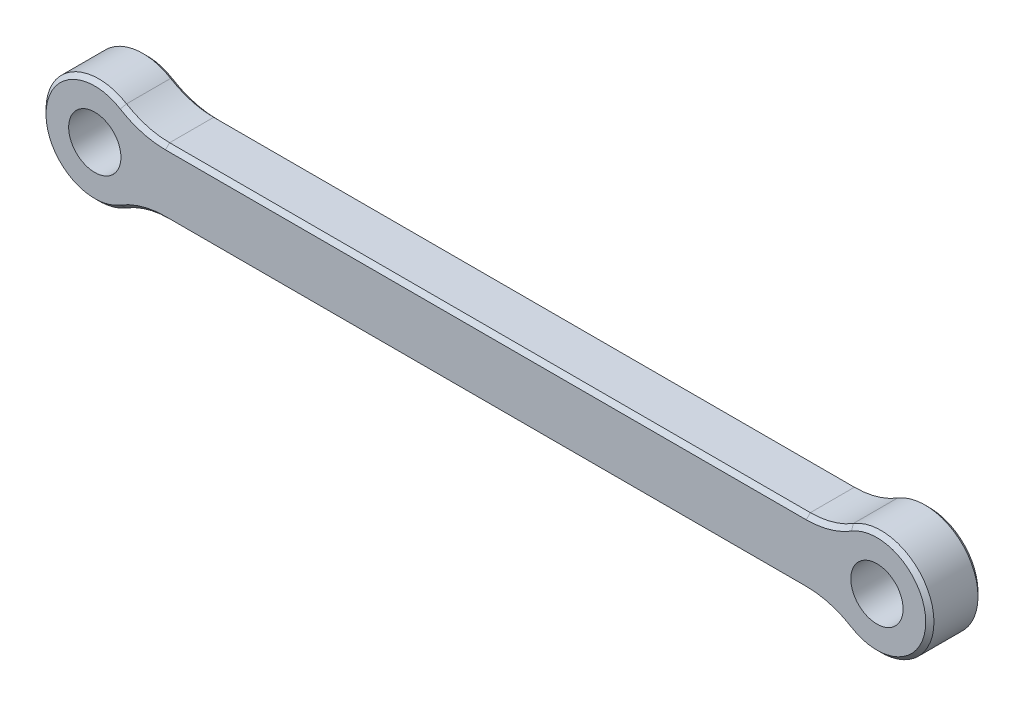
ISO-10303-21;
HEADER;
FILE_DESCRIPTION(('STEP AP214'),'2;1');
FILE_NAME('part.step','',(''),(''),'','','');
FILE_SCHEMA(('AUTOMOTIVE_DESIGN { 1 0 10303 214 1 1 1 1 }'));
ENDSEC;
DATA;
#1=APPLICATION_CONTEXT('core data for automotive mechanical design processes');
#2=APPLICATION_PROTOCOL_DEFINITION('international standard','automotive_design',2000,#1);
#3=PRODUCT_CONTEXT('',#1,'mechanical');
#4=PRODUCT('Part','Part','',(#3));
#5=PRODUCT_RELATED_PRODUCT_CATEGORY('part','',(#4));
#6=PRODUCT_DEFINITION_FORMATION('','',#4);
#7=PRODUCT_DEFINITION_CONTEXT('part definition',#1,'design');
#8=PRODUCT_DEFINITION('design','',#6,#7);
#9=PRODUCT_DEFINITION_SHAPE('','',#8);
#10=(LENGTH_UNIT() NAMED_UNIT(*) SI_UNIT(.MILLI.,.METRE.));
#11=(NAMED_UNIT(*) PLANE_ANGLE_UNIT() SI_UNIT($,.RADIAN.));
#12=(NAMED_UNIT(*) SI_UNIT($,.STERADIAN.) SOLID_ANGLE_UNIT());
#13=UNCERTAINTY_MEASURE_WITH_UNIT(LENGTH_MEASURE(1.E-05),#10,'distance_accuracy_value','');
#14=(GEOMETRIC_REPRESENTATION_CONTEXT(3) GLOBAL_UNCERTAINTY_ASSIGNED_CONTEXT((#13)) GLOBAL_UNIT_ASSIGNED_CONTEXT((#10,
#11,#12)) REPRESENTATION_CONTEXT('',''));
#15=CARTESIAN_POINT('',(0.,0.,0.));
#16=DIRECTION('',(0.,0.,1.));
#17=DIRECTION('',(1.,0.,0.));
#18=AXIS2_PLACEMENT_3D('',#15,#16,#17);
#19=CARTESIAN_POINT('',(95.,0.,6.35));
#20=DIRECTION('',(0.,0.,-1.));
#21=DIRECTION('',(-1.,0.,0.));
#22=AXIS2_PLACEMENT_3D('',#19,#20,#21);
#23=CYLINDRICAL_SURFACE('',#22,3.175);
#24=CARTESIAN_POINT('',(95.,0.,6.35));
#25=DIRECTION('',(0.,0.,1.));
#26=DIRECTION('',(1.,0.,0.));
#27=AXIS2_PLACEMENT_3D('',#24,#25,#26);
#28=CIRCLE('',#27,3.175);
#29=CARTESIAN_POINT('',(98.175,0.,6.35));
#30=VERTEX_POINT('',#29);
#31=EDGE_CURVE('E423',#30,#30,#28,.T.);
#32=ORIENTED_EDGE('',*,*,#31,.T.);
#33=EDGE_LOOP('',(#32));
#34=FACE_BOUND('',#33,.T.);
#35=CARTESIAN_POINT('',(95.,0.,0.));
#36=DIRECTION('',(0.,0.,1.));
#37=DIRECTION('',(1.,0.,0.));
#38=AXIS2_PLACEMENT_3D('',#35,#36,#37);
#39=CIRCLE('',#38,3.175);
#40=CARTESIAN_POINT('',(98.175,0.,0.));
#41=VERTEX_POINT('',#40);
#42=EDGE_CURVE('E797',#41,#41,#39,.T.);
#43=ORIENTED_EDGE('',*,*,#42,.F.);
#44=EDGE_LOOP('',(#43));
#45=FACE_BOUND('',#44,.T.);
#46=ADVANCED_FACE('F85',(#34,#45),#23,.F.);
#47=CARTESIAN_POINT('',(0.,0.,0.));
#48=DIRECTION('',(0.,0.,1.));
#49=DIRECTION('',(1.,0.,0.));
#50=AXIS2_PLACEMENT_3D('',#47,#48,#49);
#51=PLANE('',#50);
#52=CARTESIAN_POINT('',(86.4104351099721,-14.,0.));
#53=DIRECTION('',(0.,0.,1.));
#54=DIRECTION('',(1.,0.,0.));
#55=AXIS2_PLACEMENT_3D('',#52,#53,#54);
#56=CIRCLE('',#55,10.5);
#57=CARTESIAN_POINT('',(91.9014811583917,-5.05022831050228,0.));
#58=VERTEX_POINT('',#57);
#59=CARTESIAN_POINT('',(86.4104351099721,-3.5,0.));
#60=VERTEX_POINT('',#59);
#61=EDGE_CURVE('E275',#58,#60,#56,.T.);
#62=ORIENTED_EDGE('',*,*,#61,.T.);
#63=DIRECTION('',(-1.,0.,0.));
#64=VECTOR('',#63,1.);
#65=CARTESIAN_POINT('',(0.,-3.5,0.));
#66=LINE('',#65,#64);
#67=CARTESIAN_POINT('',(8.5895648900279,-3.5,0.));
#68=VERTEX_POINT('',#67);
#69=EDGE_CURVE('E210',#60,#68,#66,.T.);
#70=ORIENTED_EDGE('',*,*,#69,.T.);
#71=CARTESIAN_POINT('',(8.5895648900279,-14.,0.));
#72=DIRECTION('',(0.,0.,1.));
#73=DIRECTION('',(1.,0.,0.));
#74=AXIS2_PLACEMENT_3D('',#71,#72,#73);
#75=CIRCLE('',#74,10.5);
#76=CARTESIAN_POINT('',(3.09851884160824,-5.05022831050228,0.));
#77=VERTEX_POINT('',#76);
#78=EDGE_CURVE('E278',#68,#77,#75,.T.);
#79=ORIENTED_EDGE('',*,*,#78,.T.);
#80=CARTESIAN_POINT('',(0.,0.,0.));
#81=DIRECTION('',(0.,0.,1.));
#82=DIRECTION('',(1.,0.,0.));
#83=AXIS2_PLACEMENT_3D('',#80,#81,#82);
#84=CIRCLE('',#83,5.925);
#85=CARTESIAN_POINT('',(3.09851884160824,5.05022831050228,0.));
#86=VERTEX_POINT('',#85);
#87=EDGE_CURVE('E272',#77,#86,#84,.F.);
#88=ORIENTED_EDGE('',*,*,#87,.T.);
#89=CARTESIAN_POINT('',(8.5895648900279,14.,0.));
#90=DIRECTION('',(0.,0.,1.));
#91=DIRECTION('',(1.,0.,0.));
#92=AXIS2_PLACEMENT_3D('',#89,#90,#91);
#93=CIRCLE('',#92,10.5);
#94=CARTESIAN_POINT('',(8.5895648900279,3.5,0.));
#95=VERTEX_POINT('',#94);
#96=EDGE_CURVE('E266',#86,#95,#93,.T.);
#97=ORIENTED_EDGE('',*,*,#96,.T.);
#98=DIRECTION('',(1.,0.,0.));
#99=VECTOR('',#98,1.);
#100=CARTESIAN_POINT('',(86.4104351099721,3.5,0.));
#101=LINE('',#100,#99);
#102=CARTESIAN_POINT('',(86.4104351099721,3.5,0.));
#103=VERTEX_POINT('',#102);
#104=EDGE_CURVE('E239',#95,#103,#101,.T.);
#105=ORIENTED_EDGE('',*,*,#104,.T.);
#106=CARTESIAN_POINT('',(86.4104351099721,14.,0.));
#107=DIRECTION('',(0.,0.,1.));
#108=DIRECTION('',(1.,0.,0.));
#109=AXIS2_PLACEMENT_3D('',#106,#107,#108);
#110=CIRCLE('',#109,10.5);
#111=CARTESIAN_POINT('',(91.9014811583917,5.05022831050228,0.));
#112=VERTEX_POINT('',#111);
#113=EDGE_CURVE('E263',#103,#112,#110,.T.);
#114=ORIENTED_EDGE('',*,*,#113,.T.);
#115=CARTESIAN_POINT('',(95.,0.,0.));
#116=DIRECTION('',(0.,0.,1.));
#117=DIRECTION('',(1.,0.,0.));
#118=AXIS2_PLACEMENT_3D('',#115,#116,#117);
#119=CIRCLE('',#118,5.92500000000001);
#120=EDGE_CURVE('E269',#112,#58,#119,.F.);
#121=ORIENTED_EDGE('',*,*,#120,.T.);
#122=EDGE_LOOP('',(#62,#70,#79,#88,#97,#105,#114,#121));
#123=FACE_BOUND('',#122,.T.);
#124=ORIENTED_EDGE('',*,*,#42,.T.);
#125=EDGE_LOOP('',(#124));
#126=FACE_BOUND('',#125,.T.);
#127=CARTESIAN_POINT('',(0.,0.,0.));
#128=DIRECTION('',(0.,0.,1.));
#129=DIRECTION('',(1.,0.,0.));
#130=AXIS2_PLACEMENT_3D('',#127,#128,#129);
#131=CIRCLE('',#130,3.175);
#132=CARTESIAN_POINT('',(3.175,0.,0.));
#133=VERTEX_POINT('',#132);
#134=EDGE_CURVE('E364',#133,#133,#131,.T.);
#135=ORIENTED_EDGE('',*,*,#134,.T.);
#136=EDGE_LOOP('',(#135));
#137=FACE_BOUND('',#136,.T.);
#138=ADVANCED_FACE('F456',(#123,#126,#137),#51,.F.);
#139=CARTESIAN_POINT('',(95.,0.,6.35));
#140=DIRECTION('',(0.,0.,-1.));
#141=DIRECTION('',(-1.,0.,0.));
#142=AXIS2_PLACEMENT_3D('',#139,#140,#141);
#143=CYLINDRICAL_SURFACE('',#142,6.42500000000001);
#144=DIRECTION('',(0.,0.,-1.));
#145=VECTOR('',#144,1.);
#146=CARTESIAN_POINT('',(91.6400027751337,-5.47640791476408,6.35));
#147=LINE('',#146,#145);
#148=CARTESIAN_POINT('',(91.6400027751337,-5.47640791476408,5.85));
#149=VERTEX_POINT('',#148);
#150=CARTESIAN_POINT('',(91.6400027751337,-5.47640791476408,0.5));
#151=VERTEX_POINT('',#150);
#152=EDGE_CURVE('E418',#149,#151,#147,.T.);
#153=ORIENTED_EDGE('',*,*,#152,.T.);
#154=CARTESIAN_POINT('',(95.,0.,0.5));
#155=DIRECTION('',(0.,0.,1.));
#156=DIRECTION('',(1.,0.,0.));
#157=AXIS2_PLACEMENT_3D('',#154,#155,#156);
#158=CIRCLE('',#157,6.42500000000001);
#159=CARTESIAN_POINT('',(91.6400027751337,5.47640791476408,0.5));
#160=VERTEX_POINT('',#159);
#161=EDGE_CURVE('E299',#151,#160,#158,.T.);
#162=ORIENTED_EDGE('',*,*,#161,.T.);
#163=DIRECTION('',(0.,0.,-1.));
#164=VECTOR('',#163,1.);
#165=CARTESIAN_POINT('',(91.6400027751337,5.47640791476408,6.35));
#166=LINE('',#165,#164);
#167=CARTESIAN_POINT('',(91.6400027751337,5.47640791476408,5.85));
#168=VERTEX_POINT('',#167);
#169=EDGE_CURVE('E252',#160,#168,#166,.F.);
#170=ORIENTED_EDGE('',*,*,#169,.T.);
#171=CARTESIAN_POINT('',(95.,0.,5.85));
#172=DIRECTION('',(0.,0.,1.));
#173=DIRECTION('',(1.,0.,0.));
#174=AXIS2_PLACEMENT_3D('',#171,#172,#173);
#175=CIRCLE('',#174,6.42500000000001);
#176=EDGE_CURVE('E296',#168,#149,#175,.F.);
#177=ORIENTED_EDGE('',*,*,#176,.T.);
#178=EDGE_LOOP('',(#153,#162,#170,#177));
#179=FACE_BOUND('',#178,.T.);
#180=ADVANCED_FACE('F429',(#179),#143,.T.);
#181=CARTESIAN_POINT('',(0.,0.,6.35));
#182=DIRECTION('',(0.,0.,1.));
#183=DIRECTION('',(1.,0.,0.));
#184=AXIS2_PLACEMENT_3D('',#181,#182,#183);
#185=PLANE('',#184);
#186=CARTESIAN_POINT('',(8.5895648900279,-14.,6.35));
#187=DIRECTION('',(0.,0.,1.));
#188=DIRECTION('',(1.,0.,0.));
#189=AXIS2_PLACEMENT_3D('',#186,#187,#188);
#190=CIRCLE('',#189,10.5);
#191=CARTESIAN_POINT('',(3.09851884160824,-5.05022831050228,6.35));
#192=VERTEX_POINT('',#191);
#193=CARTESIAN_POINT('',(8.5895648900279,-3.5,6.35));
#194=VERTEX_POINT('',#193);
#195=EDGE_CURVE('E96',#192,#194,#190,.F.);
#196=ORIENTED_EDGE('',*,*,#195,.T.);
#197=DIRECTION('',(1.,0.,0.));
#198=VECTOR('',#197,1.);
#199=CARTESIAN_POINT('',(86.4104351099721,-3.5,6.35));
#200=LINE('',#199,#198);
#201=CARTESIAN_POINT('',(86.4104351099721,-3.5,6.35));
#202=VERTEX_POINT('',#201);
#203=EDGE_CURVE('E12',#194,#202,#200,.T.);
#204=ORIENTED_EDGE('',*,*,#203,.T.);
#205=CARTESIAN_POINT('',(86.4104351099721,-14.,6.35));
#206=DIRECTION('',(0.,0.,1.));
#207=DIRECTION('',(1.,0.,0.));
#208=AXIS2_PLACEMENT_3D('',#205,#206,#207);
#209=CIRCLE('',#208,10.5);
#210=CARTESIAN_POINT('',(91.9014811583917,-5.05022831050228,6.35));
#211=VERTEX_POINT('',#210);
#212=EDGE_CURVE('E335',#202,#211,#209,.F.);
#213=ORIENTED_EDGE('',*,*,#212,.T.);
#214=CARTESIAN_POINT('',(95.,0.,6.35));
#215=DIRECTION('',(0.,0.,1.));
#216=DIRECTION('',(1.,0.,0.));
#217=AXIS2_PLACEMENT_3D('',#214,#215,#216);
#218=CIRCLE('',#217,5.92500000000001);
#219=CARTESIAN_POINT('',(91.9014811583917,5.05022831050228,6.35));
#220=VERTEX_POINT('',#219);
#221=EDGE_CURVE('E329',#211,#220,#218,.T.);
#222=ORIENTED_EDGE('',*,*,#221,.T.);
#223=CARTESIAN_POINT('',(86.4104351099721,14.,6.35));
#224=DIRECTION('',(0.,0.,1.));
#225=DIRECTION('',(1.,0.,0.));
#226=AXIS2_PLACEMENT_3D('',#223,#224,#225);
#227=CIRCLE('',#226,10.5);
#228=CARTESIAN_POINT('',(86.4104351099721,3.5,6.35));
#229=VERTEX_POINT('',#228);
#230=EDGE_CURVE('E323',#220,#229,#227,.F.);
#231=ORIENTED_EDGE('',*,*,#230,.T.);
#232=DIRECTION('',(-1.,0.,0.));
#233=VECTOR('',#232,1.);
#234=CARTESIAN_POINT('',(0.,3.5,6.35));
#235=LINE('',#234,#233);
#236=CARTESIAN_POINT('',(8.5895648900279,3.5,6.35));
#237=VERTEX_POINT('',#236);
#238=EDGE_CURVE('E320',#229,#237,#235,.T.);
#239=ORIENTED_EDGE('',*,*,#238,.T.);
#240=CARTESIAN_POINT('',(8.5895648900279,14.,6.35));
#241=DIRECTION('',(0.,0.,1.));
#242=DIRECTION('',(1.,0.,0.));
#243=AXIS2_PLACEMENT_3D('',#240,#241,#242);
#244=CIRCLE('',#243,10.5);
#245=CARTESIAN_POINT('',(3.09851884160824,5.05022831050228,6.35));
#246=VERTEX_POINT('',#245);
#247=EDGE_CURVE('E326',#237,#246,#244,.F.);
#248=ORIENTED_EDGE('',*,*,#247,.T.);
#249=CARTESIAN_POINT('',(0.,0.,6.35));
#250=DIRECTION('',(0.,0.,1.));
#251=DIRECTION('',(1.,0.,0.));
#252=AXIS2_PLACEMENT_3D('',#249,#250,#251);
#253=CIRCLE('',#252,5.925);
#254=EDGE_CURVE('E332',#246,#192,#253,.T.);
#255=ORIENTED_EDGE('',*,*,#254,.T.);
#256=EDGE_LOOP('',(#196,#204,#213,#222,#231,#239,#248,#255));
#257=FACE_BOUND('',#256,.T.);
#258=ORIENTED_EDGE('',*,*,#31,.F.);
#259=EDGE_LOOP('',(#258));
#260=FACE_BOUND('',#259,.T.);
#261=CARTESIAN_POINT('',(0.,0.,6.35));
#262=DIRECTION('',(0.,0.,1.));
#263=DIRECTION('',(1.,0.,0.));
#264=AXIS2_PLACEMENT_3D('',#261,#262,#263);
#265=CIRCLE('',#264,3.175);
#266=CARTESIAN_POINT('',(3.175,0.,6.35));
#267=VERTEX_POINT('',#266);
#268=EDGE_CURVE('E792',#267,#267,#265,.T.);
#269=ORIENTED_EDGE('',*,*,#268,.F.);
#270=EDGE_LOOP('',(#269));
#271=FACE_BOUND('',#270,.T.);
#272=ADVANCED_FACE('F439',(#257,#260,#271),#185,.T.);
#273=CARTESIAN_POINT('',(0.,4.,6.35));
#274=DIRECTION('',(0.,1.,0.));
#275=DIRECTION('',(0.,0.,1.));
#276=AXIS2_PLACEMENT_3D('',#273,#274,#275);
#277=PLANE('',#276);
#278=DIRECTION('',(0.,0.,-1.));
#279=VECTOR('',#278,1.);
#280=CARTESIAN_POINT('',(86.4104351099721,4.,6.35));
#281=LINE('',#280,#279);
#282=CARTESIAN_POINT('',(86.4104351099721,4.,5.85));
#283=VERTEX_POINT('',#282);
#284=CARTESIAN_POINT('',(86.4104351099721,4.,0.5));
#285=VERTEX_POINT('',#284);
#286=EDGE_CURVE('E408',#283,#285,#281,.T.);
#287=ORIENTED_EDGE('',*,*,#286,.T.);
#288=DIRECTION('',(-1.,0.,0.));
#289=VECTOR('',#288,1.);
#290=CARTESIAN_POINT('',(8.5895648900279,4.,0.5));
#291=LINE('',#290,#289);
#292=CARTESIAN_POINT('',(8.5895648900279,4.,0.5));
#293=VERTEX_POINT('',#292);
#294=EDGE_CURVE('E317',#285,#293,#291,.T.);
#295=ORIENTED_EDGE('',*,*,#294,.T.);
#296=DIRECTION('',(0.,0.,-1.));
#297=VECTOR('',#296,1.);
#298=CARTESIAN_POINT('',(8.5895648900279,4.,6.35));
#299=LINE('',#298,#297);
#300=CARTESIAN_POINT('',(8.5895648900279,4.,5.85));
#301=VERTEX_POINT('',#300);
#302=EDGE_CURVE('E411',#293,#301,#299,.F.);
#303=ORIENTED_EDGE('',*,*,#302,.T.);
#304=DIRECTION('',(1.,0.,0.));
#305=VECTOR('',#304,1.);
#306=CARTESIAN_POINT('',(0.,4.,5.85));
#307=LINE('',#306,#305);
#308=EDGE_CURVE('E314',#301,#283,#307,.T.);
#309=ORIENTED_EDGE('',*,*,#308,.T.);
#310=EDGE_LOOP('',(#287,#295,#303,#309));
#311=FACE_BOUND('',#310,.T.);
#312=ADVANCED_FACE('F407',(#311),#277,.T.);
#313=CARTESIAN_POINT('',(0.,0.,6.35));
#314=DIRECTION('',(0.,0.,-1.));
#315=DIRECTION('',(-1.,0.,0.));
#316=AXIS2_PLACEMENT_3D('',#313,#314,#315);
#317=CYLINDRICAL_SURFACE('',#316,6.425);
#318=DIRECTION('',(0.,0.,-1.));
#319=VECTOR('',#318,1.);
#320=CARTESIAN_POINT('',(3.35999722486632,5.47640791476408,6.35));
#321=LINE('',#320,#319);
#322=CARTESIAN_POINT('',(3.35999722486632,5.47640791476408,5.85));
#323=VERTEX_POINT('',#322);
#324=CARTESIAN_POINT('',(3.35999722486632,5.47640791476408,0.5));
#325=VERTEX_POINT('',#324);
#326=EDGE_CURVE('E245',#323,#325,#321,.T.);
#327=ORIENTED_EDGE('',*,*,#326,.T.);
#328=CARTESIAN_POINT('',(0.,0.,0.5));
#329=DIRECTION('',(0.,0.,1.));
#330=DIRECTION('',(1.,0.,0.));
#331=AXIS2_PLACEMENT_3D('',#328,#329,#330);
#332=CIRCLE('',#331,6.425);
#333=CARTESIAN_POINT('',(3.35999722486632,-5.47640791476408,0.5));
#334=VERTEX_POINT('',#333);
#335=EDGE_CURVE('E293',#325,#334,#332,.T.);
#336=ORIENTED_EDGE('',*,*,#335,.T.);
#337=DIRECTION('',(0.,0.,-1.));
#338=VECTOR('',#337,1.);
#339=CARTESIAN_POINT('',(3.35999722486632,-5.47640791476408,6.35));
#340=LINE('',#339,#338);
#341=CARTESIAN_POINT('',(3.35999722486632,-5.47640791476408,5.85));
#342=VERTEX_POINT('',#341);
#343=EDGE_CURVE('E250',#334,#342,#340,.F.);
#344=ORIENTED_EDGE('',*,*,#343,.T.);
#345=CARTESIAN_POINT('',(0.,0.,5.85));
#346=DIRECTION('',(0.,0.,1.));
#347=DIRECTION('',(1.,0.,0.));
#348=AXIS2_PLACEMENT_3D('',#345,#346,#347);
#349=CIRCLE('',#348,6.425);
#350=EDGE_CURVE('E226',#342,#323,#349,.F.);
#351=ORIENTED_EDGE('',*,*,#350,.T.);
#352=EDGE_LOOP('',(#327,#336,#344,#351));
#353=FACE_BOUND('',#352,.T.);
#354=ADVANCED_FACE('F476',(#353),#317,.T.);
#355=CARTESIAN_POINT('',(0.,-4.,6.35));
#356=DIRECTION('',(0.,1.,0.));
#357=DIRECTION('',(0.,0.,1.));
#358=AXIS2_PLACEMENT_3D('',#355,#356,#357);
#359=PLANE('',#358);
#360=DIRECTION('',(0.,0.,1.));
#361=VECTOR('',#360,1.);
#362=CARTESIAN_POINT('',(8.5895648900279,-4.,0.));
#363=LINE('',#362,#361);
#364=CARTESIAN_POINT('',(8.5895648900279,-4.,5.85));
#365=VERTEX_POINT('',#364);
#366=CARTESIAN_POINT('',(8.5895648900279,-4.,0.5));
#367=VERTEX_POINT('',#366);
#368=EDGE_CURVE('E236',#365,#367,#363,.F.);
#369=ORIENTED_EDGE('',*,*,#368,.T.);
#370=DIRECTION('',(1.,0.,0.));
#371=VECTOR('',#370,1.);
#372=CARTESIAN_POINT('',(0.,-4.,0.5));
#373=LINE('',#372,#371);
#374=CARTESIAN_POINT('',(86.4104351099721,-4.,0.5));
#375=VERTEX_POINT('',#374);
#376=EDGE_CURVE('E208',#367,#375,#373,.T.);
#377=ORIENTED_EDGE('',*,*,#376,.T.);
#378=DIRECTION('',(0.,0.,1.));
#379=VECTOR('',#378,1.);
#380=CARTESIAN_POINT('',(86.4104351099721,-4.,6.35));
#381=LINE('',#380,#379);
#382=CARTESIAN_POINT('',(86.4104351099721,-4.,5.85));
#383=VERTEX_POINT('',#382);
#384=EDGE_CURVE('E234',#375,#383,#381,.T.);
#385=ORIENTED_EDGE('',*,*,#384,.T.);
#386=DIRECTION('',(-1.,0.,0.));
#387=VECTOR('',#386,1.);
#388=CARTESIAN_POINT('',(8.5895648900279,-4.,5.85));
#389=LINE('',#388,#387);
#390=EDGE_CURVE('E240',#383,#365,#389,.T.);
#391=ORIENTED_EDGE('',*,*,#390,.T.);
#392=EDGE_LOOP('',(#369,#377,#385,#391));
#393=FACE_BOUND('',#392,.T.);
#394=ADVANCED_FACE('F232',(#393),#359,.F.);
#395=CARTESIAN_POINT('',(0.,0.,6.35));
#396=DIRECTION('',(0.,0.,-1.));
#397=DIRECTION('',(-1.,0.,0.));
#398=AXIS2_PLACEMENT_3D('',#395,#396,#397);
#399=CYLINDRICAL_SURFACE('',#398,3.175);
#400=ORIENTED_EDGE('',*,*,#268,.T.);
#401=EDGE_LOOP('',(#400));
#402=FACE_BOUND('',#401,.T.);
#403=ORIENTED_EDGE('',*,*,#134,.F.);
#404=EDGE_LOOP('',(#403));
#405=FACE_BOUND('',#404,.T.);
#406=ADVANCED_FACE('F505',(#402,#405),#399,.F.);
#407=CARTESIAN_POINT('',(86.4104351099721,14.,6.35));
#408=DIRECTION('',(0.,0.,-1.));
#409=DIRECTION('',(-1.,0.,0.));
#410=AXIS2_PLACEMENT_3D('',#407,#408,#409);
#411=CYLINDRICAL_SURFACE('',#410,10.);
#412=ORIENTED_EDGE('',*,*,#169,.F.);
#413=CARTESIAN_POINT('',(86.4104351099721,14.,0.5));
#414=DIRECTION('',(0.,0.,1.));
#415=DIRECTION('',(1.,0.,0.));
#416=AXIS2_PLACEMENT_3D('',#413,#414,#415);
#417=CIRCLE('',#416,10.);
#418=EDGE_CURVE('E311',#160,#285,#417,.F.);
#419=ORIENTED_EDGE('',*,*,#418,.T.);
#420=ORIENTED_EDGE('',*,*,#286,.F.);
#421=CARTESIAN_POINT('',(86.4104351099721,14.,5.85));
#422=DIRECTION('',(0.,0.,1.));
#423=DIRECTION('',(1.,0.,0.));
#424=AXIS2_PLACEMENT_3D('',#421,#422,#423);
#425=CIRCLE('',#424,10.);
#426=EDGE_CURVE('E308',#283,#168,#425,.T.);
#427=ORIENTED_EDGE('',*,*,#426,.T.);
#428=EDGE_LOOP('',(#412,#419,#420,#427));
#429=FACE_BOUND('',#428,.T.);
#430=ADVANCED_FACE('F414',(#429),#411,.F.);
#431=CARTESIAN_POINT('',(86.4104351099721,-14.,6.35));
#432=DIRECTION('',(0.,0.,-1.));
#433=DIRECTION('',(-1.,0.,0.));
#434=AXIS2_PLACEMENT_3D('',#431,#432,#433);
#435=CYLINDRICAL_SURFACE('',#434,10.);
#436=ORIENTED_EDGE('',*,*,#384,.F.);
#437=CARTESIAN_POINT('',(86.4104351099721,-14.,0.5));
#438=DIRECTION('',(0.,0.,1.));
#439=DIRECTION('',(1.,0.,0.));
#440=AXIS2_PLACEMENT_3D('',#437,#438,#439);
#441=CIRCLE('',#440,10.);
#442=EDGE_CURVE('E217',#375,#151,#441,.F.);
#443=ORIENTED_EDGE('',*,*,#442,.T.);
#444=ORIENTED_EDGE('',*,*,#152,.F.);
#445=CARTESIAN_POINT('',(86.4104351099721,-14.,5.85));
#446=DIRECTION('',(0.,0.,1.));
#447=DIRECTION('',(1.,0.,0.));
#448=AXIS2_PLACEMENT_3D('',#445,#446,#447);
#449=CIRCLE('',#448,10.);
#450=EDGE_CURVE('E227',#149,#383,#449,.T.);
#451=ORIENTED_EDGE('',*,*,#450,.T.);
#452=EDGE_LOOP('',(#436,#443,#444,#451));
#453=FACE_BOUND('',#452,.T.);
#454=ADVANCED_FACE('F242',(#453),#435,.F.);
#455=CARTESIAN_POINT('',(8.5895648900279,-14.,6.35));
#456=DIRECTION('',(0.,0.,-1.));
#457=DIRECTION('',(-1.,0.,0.));
#458=AXIS2_PLACEMENT_3D('',#455,#456,#457);
#459=CYLINDRICAL_SURFACE('',#458,10.);
#460=ORIENTED_EDGE('',*,*,#343,.F.);
#461=CARTESIAN_POINT('',(8.5895648900279,-14.,0.5));
#462=DIRECTION('',(0.,0.,1.));
#463=DIRECTION('',(1.,0.,0.));
#464=AXIS2_PLACEMENT_3D('',#461,#462,#463);
#465=CIRCLE('',#464,10.);
#466=EDGE_CURVE('E286',#334,#367,#465,.F.);
#467=ORIENTED_EDGE('',*,*,#466,.T.);
#468=ORIENTED_EDGE('',*,*,#368,.F.);
#469=CARTESIAN_POINT('',(8.5895648900279,-14.,5.85));
#470=DIRECTION('',(0.,0.,1.));
#471=DIRECTION('',(1.,0.,0.));
#472=AXIS2_PLACEMENT_3D('',#469,#470,#471);
#473=CIRCLE('',#472,10.);
#474=EDGE_CURVE('E283',#365,#342,#473,.T.);
#475=ORIENTED_EDGE('',*,*,#474,.T.);
#476=EDGE_LOOP('',(#460,#467,#468,#475));
#477=FACE_BOUND('',#476,.T.);
#478=ADVANCED_FACE('F448',(#477),#459,.F.);
#479=CARTESIAN_POINT('',(8.5895648900279,14.,6.35));
#480=DIRECTION('',(0.,0.,-1.));
#481=DIRECTION('',(-1.,0.,0.));
#482=AXIS2_PLACEMENT_3D('',#479,#480,#481);
#483=CYLINDRICAL_SURFACE('',#482,10.);
#484=ORIENTED_EDGE('',*,*,#302,.F.);
#485=CARTESIAN_POINT('',(8.5895648900279,14.,0.5));
#486=DIRECTION('',(0.,0.,1.));
#487=DIRECTION('',(1.,0.,0.));
#488=AXIS2_PLACEMENT_3D('',#485,#486,#487);
#489=CIRCLE('',#488,10.);
#490=EDGE_CURVE('E305',#293,#325,#489,.F.);
#491=ORIENTED_EDGE('',*,*,#490,.T.);
#492=ORIENTED_EDGE('',*,*,#326,.F.);
#493=CARTESIAN_POINT('',(8.5895648900279,14.,5.85));
#494=DIRECTION('',(0.,0.,1.));
#495=DIRECTION('',(1.,0.,0.));
#496=AXIS2_PLACEMENT_3D('',#493,#494,#495);
#497=CIRCLE('',#496,10.);
#498=EDGE_CURVE('E302',#323,#301,#497,.T.);
#499=ORIENTED_EDGE('',*,*,#498,.T.);
#500=EDGE_LOOP('',(#484,#491,#492,#499));
#501=FACE_BOUND('',#500,.T.);
#502=ADVANCED_FACE('F472',(#501),#483,.F.);
#503=CARTESIAN_POINT('',(0.,3.5,0.));
#504=DIRECTION('',(0.,0.707106781186547,-0.707106781186547));
#505=DIRECTION('',(-1.,0.,0.));
#506=AXIS2_PLACEMENT_3D('',#503,#504,#505);
#507=PLANE('',#506);
#508=DIRECTION('',(0.,0.707106781186547,0.707106781186547));
#509=VECTOR('',#508,1.);
#510=CARTESIAN_POINT('',(86.4104351099721,3.5,0.));
#511=LINE('',#510,#509);
#512=EDGE_CURVE('E356',#103,#285,#511,.T.);
#513=ORIENTED_EDGE('',*,*,#512,.F.);
#514=ORIENTED_EDGE('',*,*,#104,.F.);
#515=DIRECTION('',(0.,-0.707106781186547,-0.707106781186547));
#516=VECTOR('',#515,1.);
#517=CARTESIAN_POINT('',(8.5895648900279,4.,0.5));
#518=LINE('',#517,#516);
#519=EDGE_CURVE('E360',#293,#95,#518,.T.);
#520=ORIENTED_EDGE('',*,*,#519,.F.);
#521=ORIENTED_EDGE('',*,*,#294,.F.);
#522=EDGE_LOOP('',(#513,#514,#520,#521));
#523=FACE_BOUND('',#522,.T.);
#524=ADVANCED_FACE('F468',(#523),#507,.T.);
#525=CARTESIAN_POINT('',(8.5895648900279,14.,0.));
#526=DIRECTION('',(0.,0.,-1.));
#527=DIRECTION('',(-1.,0.,0.));
#528=AXIS2_PLACEMENT_3D('',#525,#526,#527);
#529=CONICAL_SURFACE('',#528,10.5,0.785398163397448);
#530=ORIENTED_EDGE('',*,*,#519,.T.);
#531=ORIENTED_EDGE('',*,*,#96,.F.);
#532=DIRECTION('',(-0.369786275870965,-0.602708976353829,-0.707106781186549));
#533=VECTOR('',#532,1.);
#534=CARTESIAN_POINT('',(3.35999722486632,5.47640791476408,0.5));
#535=LINE('',#534,#533);
#536=EDGE_CURVE('E352',#325,#86,#535,.T.);
#537=ORIENTED_EDGE('',*,*,#536,.F.);
#538=ORIENTED_EDGE('',*,*,#490,.F.);
#539=EDGE_LOOP('',(#530,#531,#537,#538));
#540=FACE_BOUND('',#539,.T.);
#541=ADVANCED_FACE('F481',(#540),#529,.F.);
#542=CARTESIAN_POINT('',(86.4104351099721,14.,0.));
#543=DIRECTION('',(0.,0.,-1.));
#544=DIRECTION('',(-1.,0.,0.));
#545=AXIS2_PLACEMENT_3D('',#542,#543,#544);
#546=CONICAL_SURFACE('',#545,10.5,0.785398163397448);
#547=ORIENTED_EDGE('',*,*,#512,.T.);
#548=ORIENTED_EDGE('',*,*,#418,.F.);
#549=DIRECTION('',(-0.369786275870958,0.602708976353832,0.70710678118655));
#550=VECTOR('',#549,1.);
#551=CARTESIAN_POINT('',(91.9014811583917,5.05022831050228,0.));
#552=LINE('',#551,#550);
#553=EDGE_CURVE('E348',#112,#160,#552,.T.);
#554=ORIENTED_EDGE('',*,*,#553,.F.);
#555=ORIENTED_EDGE('',*,*,#113,.F.);
#556=EDGE_LOOP('',(#547,#548,#554,#555));
#557=FACE_BOUND('',#556,.T.);
#558=ADVANCED_FACE('F464',(#557),#546,.F.);
#559=CARTESIAN_POINT('',(0.,0.,0.5));
#560=DIRECTION('',(0.,0.,1.));
#561=DIRECTION('',(1.,0.,0.));
#562=AXIS2_PLACEMENT_3D('',#559,#560,#561);
#563=CONICAL_SURFACE('',#562,6.425,0.785398163397448);
#564=ORIENTED_EDGE('',*,*,#536,.T.);
#565=ORIENTED_EDGE('',*,*,#87,.F.);
#566=DIRECTION('',(-0.369786275870965,0.60270897635383,-0.707106781186547));
#567=VECTOR('',#566,1.);
#568=CARTESIAN_POINT('',(3.35999722486632,-5.47640791476408,0.5));
#569=LINE('',#568,#567);
#570=EDGE_CURVE('E344',#334,#77,#569,.T.);
#571=ORIENTED_EDGE('',*,*,#570,.F.);
#572=ORIENTED_EDGE('',*,*,#335,.F.);
#573=EDGE_LOOP('',(#564,#565,#571,#572));
#574=FACE_BOUND('',#573,.T.);
#575=ADVANCED_FACE('F483',(#574),#563,.T.);
#576=CARTESIAN_POINT('',(95.,0.,0.5));
#577=DIRECTION('',(0.,0.,1.));
#578=DIRECTION('',(1.,0.,0.));
#579=AXIS2_PLACEMENT_3D('',#576,#577,#578);
#580=CONICAL_SURFACE('',#579,6.42500000000001,0.785398163397447);
#581=ORIENTED_EDGE('',*,*,#553,.T.);
#582=ORIENTED_EDGE('',*,*,#161,.F.);
#583=DIRECTION('',(-0.369786275870958,-0.602708976353835,0.707106781186548));
#584=VECTOR('',#583,1.);
#585=CARTESIAN_POINT('',(91.9014811583917,-5.05022831050228,0.));
#586=LINE('',#585,#584);
#587=EDGE_CURVE('E220',#58,#151,#586,.T.);
#588=ORIENTED_EDGE('',*,*,#587,.F.);
#589=ORIENTED_EDGE('',*,*,#120,.F.);
#590=EDGE_LOOP('',(#581,#582,#588,#589));
#591=FACE_BOUND('',#590,.T.);
#592=ADVANCED_FACE('F462',(#591),#580,.T.);
#593=CARTESIAN_POINT('',(8.5895648900279,-14.,0.));
#594=DIRECTION('',(0.,0.,-1.));
#595=DIRECTION('',(-1.,0.,0.));
#596=AXIS2_PLACEMENT_3D('',#593,#594,#595);
#597=CONICAL_SURFACE('',#596,10.5,0.785398163397448);
#598=ORIENTED_EDGE('',*,*,#570,.T.);
#599=ORIENTED_EDGE('',*,*,#78,.F.);
#600=DIRECTION('',(0.,0.707106781186549,-0.707106781186546));
#601=VECTOR('',#600,1.);
#602=CARTESIAN_POINT('',(8.5895648900279,-4.,0.5));
#603=LINE('',#602,#601);
#604=EDGE_CURVE('E214',#367,#68,#603,.T.);
#605=ORIENTED_EDGE('',*,*,#604,.F.);
#606=ORIENTED_EDGE('',*,*,#466,.F.);
#607=EDGE_LOOP('',(#598,#599,#605,#606));
#608=FACE_BOUND('',#607,.T.);
#609=ADVANCED_FACE('F452',(#608),#597,.F.);
#610=CARTESIAN_POINT('',(86.4104351099721,-14.,0.));
#611=DIRECTION('',(0.,0.,-1.));
#612=DIRECTION('',(-1.,0.,0.));
#613=AXIS2_PLACEMENT_3D('',#610,#611,#612);
#614=CONICAL_SURFACE('',#613,10.5,0.785398163397447);
#615=ORIENTED_EDGE('',*,*,#587,.T.);
#616=ORIENTED_EDGE('',*,*,#442,.F.);
#617=DIRECTION('',(0.,-0.707106781186546,0.707106781186549));
#618=VECTOR('',#617,1.);
#619=CARTESIAN_POINT('',(86.4104351099721,-3.5,0.));
#620=LINE('',#619,#618);
#621=EDGE_CURVE('E204',#60,#375,#620,.T.);
#622=ORIENTED_EDGE('',*,*,#621,.F.);
#623=ORIENTED_EDGE('',*,*,#61,.F.);
#624=EDGE_LOOP('',(#615,#616,#622,#623));
#625=FACE_BOUND('',#624,.T.);
#626=ADVANCED_FACE('F218',(#625),#614,.F.);
#627=CARTESIAN_POINT('',(0.,-4.,0.5));
#628=DIRECTION('',(0.,0.707106781186547,0.707106781186547));
#629=DIRECTION('',(1.,0.,0.));
#630=AXIS2_PLACEMENT_3D('',#627,#628,#629);
#631=PLANE('',#630);
#632=ORIENTED_EDGE('',*,*,#604,.T.);
#633=ORIENTED_EDGE('',*,*,#69,.F.);
#634=ORIENTED_EDGE('',*,*,#621,.T.);
#635=ORIENTED_EDGE('',*,*,#376,.F.);
#636=EDGE_LOOP('',(#632,#633,#634,#635));
#637=FACE_BOUND('',#636,.T.);
#638=ADVANCED_FACE('F206',(#637),#631,.F.);
#639=CARTESIAN_POINT('',(0.,4.,5.85));
#640=DIRECTION('',(0.,-0.707106781186547,-0.707106781186547));
#641=DIRECTION('',(1.,0.,0.));
#642=AXIS2_PLACEMENT_3D('',#639,#640,#641);
#643=PLANE('',#642);
#644=DIRECTION('',(0.,-0.707106781186547,0.707106781186547));
#645=VECTOR('',#644,1.);
#646=CARTESIAN_POINT('',(86.4104351099721,4.,5.85));
#647=LINE('',#646,#645);
#648=EDGE_CURVE('E385',#283,#229,#647,.T.);
#649=ORIENTED_EDGE('',*,*,#648,.F.);
#650=ORIENTED_EDGE('',*,*,#308,.F.);
#651=DIRECTION('',(0.,0.707106781186547,-0.707106781186547));
#652=VECTOR('',#651,1.);
#653=CARTESIAN_POINT('',(8.5895648900279,3.5,6.35));
#654=LINE('',#653,#652);
#655=EDGE_CURVE('E90',#237,#301,#654,.T.);
#656=ORIENTED_EDGE('',*,*,#655,.F.);
#657=ORIENTED_EDGE('',*,*,#238,.F.);
#658=EDGE_LOOP('',(#649,#650,#656,#657));
#659=FACE_BOUND('',#658,.T.);
#660=ADVANCED_FACE('F88',(#659),#643,.F.);
#661=CARTESIAN_POINT('',(8.5895648900279,14.,6.35));
#662=DIRECTION('',(0.,0.,1.));
#663=DIRECTION('',(1.,0.,0.));
#664=AXIS2_PLACEMENT_3D('',#661,#662,#663);
#665=CONICAL_SURFACE('',#664,10.5,0.785398163397448);
#666=ORIENTED_EDGE('',*,*,#655,.T.);
#667=ORIENTED_EDGE('',*,*,#498,.F.);
#668=DIRECTION('',(0.369786275870966,0.60270897635383,-0.707106781186547));
#669=VECTOR('',#668,1.);
#670=CARTESIAN_POINT('',(3.09851884160824,5.05022831050228,6.35));
#671=LINE('',#670,#669);
#672=EDGE_CURVE('E382',#246,#323,#671,.T.);
#673=ORIENTED_EDGE('',*,*,#672,.F.);
#674=ORIENTED_EDGE('',*,*,#247,.F.);
#675=EDGE_LOOP('',(#666,#667,#673,#674));
#676=FACE_BOUND('',#675,.T.);
#677=ADVANCED_FACE('F398',(#676),#665,.F.);
#678=CARTESIAN_POINT('',(86.4104351099721,14.,6.35));
#679=DIRECTION('',(0.,0.,1.));
#680=DIRECTION('',(1.,0.,0.));
#681=AXIS2_PLACEMENT_3D('',#678,#679,#680);
#682=CONICAL_SURFACE('',#681,10.5,0.785398163397448);
#683=ORIENTED_EDGE('',*,*,#648,.T.);
#684=ORIENTED_EDGE('',*,*,#230,.F.);
#685=DIRECTION('',(0.369786275870958,-0.602708976353832,0.70710678118655));
#686=VECTOR('',#685,1.);
#687=CARTESIAN_POINT('',(91.6400027751337,5.47640791476408,5.85));
#688=LINE('',#687,#686);
#689=EDGE_CURVE('E378',#168,#220,#688,.T.);
#690=ORIENTED_EDGE('',*,*,#689,.F.);
#691=ORIENTED_EDGE('',*,*,#426,.F.);
#692=EDGE_LOOP('',(#683,#684,#690,#691));
#693=FACE_BOUND('',#692,.T.);
#694=ADVANCED_FACE('F432',(#693),#682,.F.);
#695=CARTESIAN_POINT('',(0.,0.,6.35));
#696=DIRECTION('',(0.,0.,-1.));
#697=DIRECTION('',(-1.,0.,0.));
#698=AXIS2_PLACEMENT_3D('',#695,#696,#697);
#699=CONICAL_SURFACE('',#698,5.925,0.785398163397448);
#700=ORIENTED_EDGE('',*,*,#672,.T.);
#701=ORIENTED_EDGE('',*,*,#350,.F.);
#702=DIRECTION('',(0.369786275870965,-0.60270897635383,-0.707106781186547));
#703=VECTOR('',#702,1.);
#704=CARTESIAN_POINT('',(3.09851884160824,-5.05022831050228,6.35));
#705=LINE('',#704,#703);
#706=EDGE_CURVE('E374',#192,#342,#705,.T.);
#707=ORIENTED_EDGE('',*,*,#706,.F.);
#708=ORIENTED_EDGE('',*,*,#254,.F.);
#709=EDGE_LOOP('',(#700,#701,#707,#708));
#710=FACE_BOUND('',#709,.T.);
#711=ADVANCED_FACE('F575',(#710),#699,.T.);
#712=CARTESIAN_POINT('',(95.,0.,6.35));
#713=DIRECTION('',(0.,0.,-1.));
#714=DIRECTION('',(-1.,0.,0.));
#715=AXIS2_PLACEMENT_3D('',#712,#713,#714);
#716=CONICAL_SURFACE('',#715,5.92500000000001,0.785398163397447);
#717=ORIENTED_EDGE('',*,*,#689,.T.);
#718=ORIENTED_EDGE('',*,*,#221,.F.);
#719=DIRECTION('',(0.369786275870958,0.602708976353835,0.707106781186548));
#720=VECTOR('',#719,1.);
#721=CARTESIAN_POINT('',(91.6400027751337,-5.47640791476408,5.85));
#722=LINE('',#721,#720);
#723=EDGE_CURVE('E370',#149,#211,#722,.T.);
#724=ORIENTED_EDGE('',*,*,#723,.F.);
#725=ORIENTED_EDGE('',*,*,#176,.F.);
#726=EDGE_LOOP('',(#717,#718,#724,#725));
#727=FACE_BOUND('',#726,.T.);
#728=ADVANCED_FACE('F436',(#727),#716,.T.);
#729=CARTESIAN_POINT('',(8.5895648900279,-14.,6.35));
#730=DIRECTION('',(0.,0.,1.));
#731=DIRECTION('',(1.,0.,0.));
#732=AXIS2_PLACEMENT_3D('',#729,#730,#731);
#733=CONICAL_SURFACE('',#732,10.5,0.785398163397448);
#734=ORIENTED_EDGE('',*,*,#706,.T.);
#735=ORIENTED_EDGE('',*,*,#474,.F.);
#736=DIRECTION('',(0.,-0.707106781186547,-0.707106781186547));
#737=VECTOR('',#736,1.);
#738=CARTESIAN_POINT('',(8.5895648900279,-3.5,6.35));
#739=LINE('',#738,#737);
#740=EDGE_CURVE('E367',#194,#365,#739,.T.);
#741=ORIENTED_EDGE('',*,*,#740,.F.);
#742=ORIENTED_EDGE('',*,*,#195,.F.);
#743=EDGE_LOOP('',(#734,#735,#741,#742));
#744=FACE_BOUND('',#743,.T.);
#745=ADVANCED_FACE('F444',(#744),#733,.F.);
#746=CARTESIAN_POINT('',(86.4104351099721,-14.,6.35));
#747=DIRECTION('',(0.,0.,1.));
#748=DIRECTION('',(1.,0.,0.));
#749=AXIS2_PLACEMENT_3D('',#746,#747,#748);
#750=CONICAL_SURFACE('',#749,10.5,0.785398163397447);
#751=ORIENTED_EDGE('',*,*,#723,.T.);
#752=ORIENTED_EDGE('',*,*,#212,.F.);
#753=DIRECTION('',(0.,0.707106781186546,0.707106781186549));
#754=VECTOR('',#753,1.);
#755=CARTESIAN_POINT('',(86.4104351099721,-4.,5.85));
#756=LINE('',#755,#754);
#757=EDGE_CURVE('E110',#383,#202,#756,.T.);
#758=ORIENTED_EDGE('',*,*,#757,.F.);
#759=ORIENTED_EDGE('',*,*,#450,.F.);
#760=EDGE_LOOP('',(#751,#752,#758,#759));
#761=FACE_BOUND('',#760,.T.);
#762=ADVANCED_FACE('F438',(#761),#750,.F.);
#763=CARTESIAN_POINT('',(0.,-3.5,6.35));
#764=DIRECTION('',(0.,-0.707106781186547,0.707106781186547));
#765=DIRECTION('',(-1.,0.,0.));
#766=AXIS2_PLACEMENT_3D('',#763,#764,#765);
#767=PLANE('',#766);
#768=ORIENTED_EDGE('',*,*,#740,.T.);
#769=ORIENTED_EDGE('',*,*,#390,.F.);
#770=ORIENTED_EDGE('',*,*,#757,.T.);
#771=ORIENTED_EDGE('',*,*,#203,.F.);
#772=EDGE_LOOP('',(#768,#769,#770,#771));
#773=FACE_BOUND('',#772,.T.);
#774=ADVANCED_FACE('F441',(#773),#767,.T.);
#775=CLOSED_SHELL('',(#46,#138,#180,#272,#312,#354,#394,#406,#430,#454,#478,#502,#524,#541,#558,
#575,#592,#609,#626,#638,#660,#677,#694,#711,#728,#745,#762,#774));
#776=MANIFOLD_SOLID_BREP('B2',#775);
#777=ADVANCED_BREP_SHAPE_REPRESENTATION('',(#18,#776),#14);
#778=SHAPE_DEFINITION_REPRESENTATION(#9,#777);
ENDSEC;
END-ISO-10303-21;
